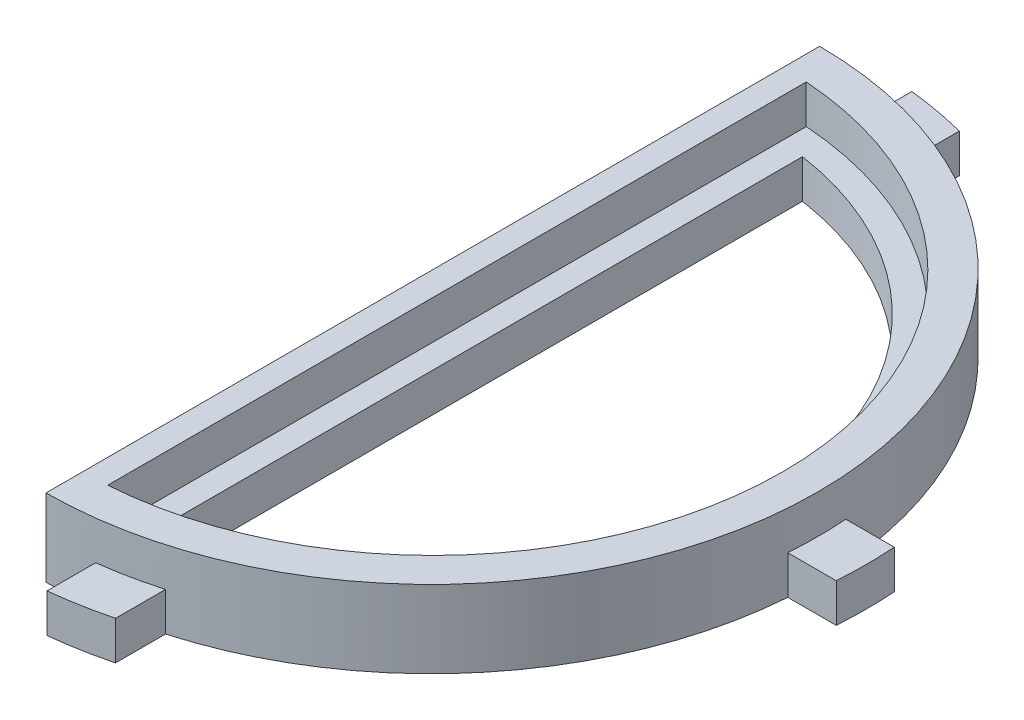
ISO-10303-21;
HEADER;
FILE_DESCRIPTION(('STEP AP214'),'2;1');
FILE_NAME('part.step','',(''),(''),'','','');
FILE_SCHEMA(('AUTOMOTIVE_DESIGN { 1 0 10303 214 1 1 1 1 }'));
ENDSEC;
DATA;
#1=APPLICATION_CONTEXT('core data for automotive mechanical design processes');
#2=APPLICATION_PROTOCOL_DEFINITION('international standard','automotive_design',2000,#1);
#3=PRODUCT_CONTEXT('',#1,'mechanical');
#4=PRODUCT('Part','Part','',(#3));
#5=PRODUCT_RELATED_PRODUCT_CATEGORY('part','',(#4));
#6=PRODUCT_DEFINITION_FORMATION('','',#4);
#7=PRODUCT_DEFINITION_CONTEXT('part definition',#1,'design');
#8=PRODUCT_DEFINITION('design','',#6,#7);
#9=PRODUCT_DEFINITION_SHAPE('','',#8);
#10=(LENGTH_UNIT() NAMED_UNIT(*) SI_UNIT(.MILLI.,.METRE.));
#11=(NAMED_UNIT(*) PLANE_ANGLE_UNIT() SI_UNIT($,.RADIAN.));
#12=(NAMED_UNIT(*) SI_UNIT($,.STERADIAN.) SOLID_ANGLE_UNIT());
#13=UNCERTAINTY_MEASURE_WITH_UNIT(LENGTH_MEASURE(1.E-05),#10,'distance_accuracy_value','');
#14=(GEOMETRIC_REPRESENTATION_CONTEXT(3) GLOBAL_UNCERTAINTY_ASSIGNED_CONTEXT((#13)) GLOBAL_UNIT_ASSIGNED_CONTEXT((#10,
#11,#12)) REPRESENTATION_CONTEXT('',''));
#15=CARTESIAN_POINT('',(0.,0.,0.));
#16=DIRECTION('',(0.,0.,1.));
#17=DIRECTION('',(1.,0.,0.));
#18=AXIS2_PLACEMENT_3D('',#15,#16,#17);
#19=CARTESIAN_POINT('',(0.,21.3,14.9999310053877));
#20=DIRECTION('',(0.,-1.,0.));
#21=DIRECTION('',(0.,0.,-1.));
#22=AXIS2_PLACEMENT_3D('',#19,#20,#21);
#23=PLANE('',#22);
#24=DIRECTION('',(0.,0.,-1.));
#25=VECTOR('',#24,1.);
#26=CARTESIAN_POINT('',(0.,21.3,14.9999310053877));
#27=LINE('',#26,#25);
#28=CARTESIAN_POINT('',(0.,21.3,9.99989650778399));
#29=VERTEX_POINT('',#28);
#30=CARTESIAN_POINT('',(0.,21.3,-9.99989650778399));
#31=VERTEX_POINT('',#30);
#32=EDGE_CURVE('E314',#29,#31,#27,.T.);
#33=ORIENTED_EDGE('',*,*,#32,.F.);
#34=CARTESIAN_POINT('',(-0.0454954240498573,21.3,0.));
#35=DIRECTION('',(0.,-1.,0.));
#36=DIRECTION('',(0.,0.,-1.));
#37=AXIS2_PLACEMENT_3D('',#34,#35,#36);
#38=CIRCLE('',#37,10.);
#39=EDGE_CURVE('E315',#29,#31,#38,.F.);
#40=ORIENTED_EDGE('',*,*,#39,.T.);
#41=EDGE_LOOP('',(#33,#40));
#42=FACE_BOUND('',#41,.T.);
#43=CARTESIAN_POINT('',(0.,21.3,0.));
#44=DIRECTION('',(0.,1.,0.));
#45=DIRECTION('',(0.,0.,1.));
#46=AXIS2_PLACEMENT_3D('',#43,#44,#45);
#47=CIRCLE('',#46,9.05);
#48=CARTESIAN_POINT('',(0.625000000000002,21.3,-9.02839271409922));
#49=VERTEX_POINT('',#48);
#50=CARTESIAN_POINT('',(0.625000000000002,21.3,9.02839271409923));
#51=VERTEX_POINT('',#50);
#52=EDGE_CURVE('E57',#49,#51,#47,.F.);
#53=ORIENTED_EDGE('',*,*,#52,.T.);
#54=DIRECTION('',(0.,0.,1.));
#55=VECTOR('',#54,1.);
#56=CARTESIAN_POINT('',(0.625000000000002,21.3,0.));
#57=LINE('',#56,#55);
#58=EDGE_CURVE('E182',#49,#51,#57,.T.);
#59=ORIENTED_EDGE('',*,*,#58,.F.);
#60=EDGE_LOOP('',(#53,#59));
#61=FACE_BOUND('',#60,.T.);
#62=ADVANCED_FACE('F41',(#42,#61),#23,.F.);
#63=CARTESIAN_POINT('',(0.,19.3,0.));
#64=DIRECTION('',(0.,1.,0.));
#65=DIRECTION('',(0.,0.,1.));
#66=AXIS2_PLACEMENT_3D('',#63,#64,#65);
#67=CYLINDRICAL_SURFACE('',#66,8.4);
#68=CARTESIAN_POINT('',(0.,20.3,0.));
#69=DIRECTION('',(0.,1.,0.));
#70=DIRECTION('',(0.,0.,1.));
#71=AXIS2_PLACEMENT_3D('',#68,#69,#70);
#72=CIRCLE('',#71,8.4);
#73=CARTESIAN_POINT('',(1.25,20.3,-8.30647337923863));
#74=VERTEX_POINT('',#73);
#75=CARTESIAN_POINT('',(1.25,20.3,8.30647337923863));
#76=VERTEX_POINT('',#75);
#77=EDGE_CURVE('E64',#74,#76,#72,.F.);
#78=ORIENTED_EDGE('',*,*,#77,.F.);
#79=DIRECTION('',(0.,1.,0.));
#80=VECTOR('',#79,1.);
#81=CARTESIAN_POINT('',(1.25,19.3,-8.30647337923863));
#82=LINE('',#81,#80);
#83=CARTESIAN_POINT('',(1.25,19.3,-8.30647337923863));
#84=VERTEX_POINT('',#83);
#85=EDGE_CURVE('E206',#84,#74,#82,.T.);
#86=ORIENTED_EDGE('',*,*,#85,.F.);
#87=CARTESIAN_POINT('',(0.,19.3,0.));
#88=DIRECTION('',(0.,1.,0.));
#89=DIRECTION('',(0.,0.,-1.));
#90=AXIS2_PLACEMENT_3D('',#87,#88,#89);
#91=CIRCLE('',#90,8.4);
#92=CARTESIAN_POINT('',(1.25,19.3,8.30647337923863));
#93=VERTEX_POINT('',#92);
#94=EDGE_CURVE('E197',#93,#84,#91,.T.);
#95=ORIENTED_EDGE('',*,*,#94,.F.);
#96=DIRECTION('',(0.,1.,0.));
#97=VECTOR('',#96,1.);
#98=CARTESIAN_POINT('',(1.25,19.3,8.30647337923863));
#99=LINE('',#98,#97);
#100=EDGE_CURVE('E207',#93,#76,#99,.T.);
#101=ORIENTED_EDGE('',*,*,#100,.T.);
#102=EDGE_LOOP('',(#78,#86,#95,#101));
#103=FACE_BOUND('',#102,.T.);
#104=ADVANCED_FACE('F408',(#103),#67,.F.);
#105=CARTESIAN_POINT('',(1.25,19.3,-8.30647337923863));
#106=DIRECTION('',(-1.,0.,0.));
#107=DIRECTION('',(0.,0.,1.));
#108=AXIS2_PLACEMENT_3D('',#105,#106,#107);
#109=PLANE('',#108);
#110=DIRECTION('',(0.,0.,-1.));
#111=VECTOR('',#110,1.);
#112=CARTESIAN_POINT('',(1.25,20.3,0.));
#113=LINE('',#112,#111);
#114=EDGE_CURVE('E175',#76,#74,#113,.T.);
#115=ORIENTED_EDGE('',*,*,#114,.F.);
#116=ORIENTED_EDGE('',*,*,#100,.F.);
#117=DIRECTION('',(0.,0.,1.));
#118=VECTOR('',#117,1.);
#119=CARTESIAN_POINT('',(1.25,19.3,-8.30647337923863));
#120=LINE('',#119,#118);
#121=EDGE_CURVE('E202',#84,#93,#120,.T.);
#122=ORIENTED_EDGE('',*,*,#121,.F.);
#123=ORIENTED_EDGE('',*,*,#85,.T.);
#124=EDGE_LOOP('',(#115,#116,#122,#123));
#125=FACE_BOUND('',#124,.T.);
#126=ADVANCED_FACE('F413',(#125),#109,.F.);
#127=CARTESIAN_POINT('',(-0.0454954240498573,-1.6,0.));
#128=DIRECTION('',(0.,-1.,0.));
#129=DIRECTION('',(0.,0.,-1.));
#130=AXIS2_PLACEMENT_3D('',#127,#128,#129);
#131=CYLINDRICAL_SURFACE('',#130,10.);
#132=DIRECTION('',(0.,-1.,0.));
#133=VECTOR('',#132,1.);
#134=CARTESIAN_POINT('',(9.9263399135397,-1.6,0.749999999999998));
#135=LINE('',#134,#133);
#136=CARTESIAN_POINT('',(9.9263399135397,20.3,0.75));
#137=VERTEX_POINT('',#136);
#138=CARTESIAN_POINT('',(9.9263399135397,19.3,0.750000000000001));
#139=VERTEX_POINT('',#138);
#140=EDGE_CURVE('E254',#137,#139,#135,.T.);
#141=ORIENTED_EDGE('',*,*,#140,.F.);
#142=CARTESIAN_POINT('',(-0.0454954240498573,20.3,0.));
#143=DIRECTION('',(0.,-1.,0.));
#144=DIRECTION('',(0.,0.,-1.));
#145=AXIS2_PLACEMENT_3D('',#142,#143,#144);
#146=CIRCLE('',#145,10.);
#147=CARTESIAN_POINT('',(9.9263399135397,20.3,-0.75));
#148=VERTEX_POINT('',#147);
#149=EDGE_CURVE('E219',#148,#137,#146,.T.);
#150=ORIENTED_EDGE('',*,*,#149,.F.);
#151=DIRECTION('',(0.,-1.,0.));
#152=VECTOR('',#151,1.);
#153=CARTESIAN_POINT('',(9.9263399135397,-1.6,-0.750000000000005));
#154=LINE('',#153,#152);
#155=CARTESIAN_POINT('',(9.9263399135397,19.3,-0.750000000000001));
#156=VERTEX_POINT('',#155);
#157=EDGE_CURVE('E250',#156,#148,#154,.F.);
#158=ORIENTED_EDGE('',*,*,#157,.F.);
#159=CARTESIAN_POINT('',(-0.0454954240498573,19.3,0.));
#160=DIRECTION('',(0.,1.,0.));
#161=DIRECTION('',(0.,0.,1.));
#162=AXIS2_PLACEMENT_3D('',#159,#160,#161);
#163=CIRCLE('',#162,10.);
#164=CARTESIAN_POINT('',(2.70450457595015,19.3,-9.6144422615147));
#165=VERTEX_POINT('',#164);
#166=EDGE_CURVE('E324',#165,#156,#163,.F.);
#167=ORIENTED_EDGE('',*,*,#166,.F.);
#168=DIRECTION('',(0.,-1.,0.));
#169=VECTOR('',#168,1.);
#170=CARTESIAN_POINT('',(2.70450457595015,-1.6,-9.6144422615147));
#171=LINE('',#170,#169);
#172=CARTESIAN_POINT('',(2.70450457595014,20.3,-9.6144422615147));
#173=VERTEX_POINT('',#172);
#174=EDGE_CURVE('E50',#173,#165,#171,.T.);
#175=ORIENTED_EDGE('',*,*,#174,.F.);
#176=CARTESIAN_POINT('',(-0.0454954240498573,20.3,0.));
#177=DIRECTION('',(0.,-1.,0.));
#178=DIRECTION('',(0.,0.,-1.));
#179=AXIS2_PLACEMENT_3D('',#176,#177,#178);
#180=CIRCLE('',#179,10.);
#181=CARTESIAN_POINT('',(1.20450457595015,20.3,-9.92156741649221));
#182=VERTEX_POINT('',#181);
#183=EDGE_CURVE('E340',#182,#173,#180,.T.);
#184=ORIENTED_EDGE('',*,*,#183,.F.);
#185=DIRECTION('',(0.,-1.,0.));
#186=VECTOR('',#185,1.);
#187=CARTESIAN_POINT('',(1.20450457595015,-1.6,-9.92156741649221));
#188=LINE('',#187,#186);
#189=CARTESIAN_POINT('',(1.20450457595015,19.3,-9.92156741649221));
#190=VERTEX_POINT('',#189);
#191=EDGE_CURVE('E11',#190,#182,#188,.F.);
#192=ORIENTED_EDGE('',*,*,#191,.F.);
#193=CARTESIAN_POINT('',(0.,19.3,-9.99989650778399));
#194=VERTEX_POINT('',#193);
#195=EDGE_CURVE('E320',#194,#190,#163,.F.);
#196=ORIENTED_EDGE('',*,*,#195,.F.);
#197=DIRECTION('',(0.,-1.,0.));
#198=VECTOR('',#197,1.);
#199=CARTESIAN_POINT('',(0.,-1.6,-9.99989650778399));
#200=LINE('',#199,#198);
#201=EDGE_CURVE('E279',#194,#31,#200,.F.);
#202=ORIENTED_EDGE('',*,*,#201,.T.);
#203=ORIENTED_EDGE('',*,*,#39,.F.);
#204=DIRECTION('',(0.,-1.,0.));
#205=VECTOR('',#204,1.);
#206=CARTESIAN_POINT('',(0.,-1.6,9.99989650778399));
#207=LINE('',#206,#205);
#208=CARTESIAN_POINT('',(0.,19.3,9.99989650778399));
#209=VERTEX_POINT('',#208);
#210=EDGE_CURVE('E319',#209,#29,#207,.F.);
#211=ORIENTED_EDGE('',*,*,#210,.F.);
#212=CARTESIAN_POINT('',(1.20450457595015,19.3,9.92156741649221));
#213=VERTEX_POINT('',#212);
#214=EDGE_CURVE('E335',#213,#209,#163,.F.);
#215=ORIENTED_EDGE('',*,*,#214,.F.);
#216=DIRECTION('',(0.,-1.,0.));
#217=VECTOR('',#216,1.);
#218=CARTESIAN_POINT('',(1.20450457595015,-1.6,9.92156741649221));
#219=LINE('',#218,#217);
#220=CARTESIAN_POINT('',(1.20450457595015,20.3,9.92156741649221));
#221=VERTEX_POINT('',#220);
#222=EDGE_CURVE('E344',#221,#213,#219,.T.);
#223=ORIENTED_EDGE('',*,*,#222,.F.);
#224=CARTESIAN_POINT('',(2.70450457595014,20.3,9.6144422615147));
#225=VERTEX_POINT('',#224);
#226=EDGE_CURVE('E318',#225,#221,#180,.T.);
#227=ORIENTED_EDGE('',*,*,#226,.F.);
#228=DIRECTION('',(0.,-1.,0.));
#229=VECTOR('',#228,1.);
#230=CARTESIAN_POINT('',(2.70450457595015,-1.6,9.6144422615147));
#231=LINE('',#230,#229);
#232=CARTESIAN_POINT('',(2.70450457595015,19.3,9.6144422615147));
#233=VERTEX_POINT('',#232);
#234=EDGE_CURVE('E339',#233,#225,#231,.F.);
#235=ORIENTED_EDGE('',*,*,#234,.F.);
#236=EDGE_CURVE('E325',#139,#233,#163,.F.);
#237=ORIENTED_EDGE('',*,*,#236,.F.);
#238=EDGE_LOOP('',(#141,#150,#158,#167,#175,#184,#192,#196,#202,#203,#211,#215,#223,#227,#235,#237));
#239=FACE_BOUND('',#238,.T.);
#240=ADVANCED_FACE('F378',(#239),#131,.T.);
#241=CARTESIAN_POINT('',(0.,19.3,14.9999310053877));
#242=DIRECTION('',(0.,1.,0.));
#243=DIRECTION('',(0.,0.,1.));
#244=AXIS2_PLACEMENT_3D('',#241,#242,#243);
#245=PLANE('',#244);
#246=ORIENTED_EDGE('',*,*,#121,.T.);
#247=ORIENTED_EDGE('',*,*,#94,.T.);
#248=EDGE_LOOP('',(#246,#247));
#249=FACE_BOUND('',#248,.T.);
#250=ORIENTED_EDGE('',*,*,#166,.T.);
#251=DIRECTION('',(-1.,0.,0.));
#252=VECTOR('',#251,1.);
#253=CARTESIAN_POINT('',(11.2055045759501,19.3,-0.75));
#254=LINE('',#253,#252);
#255=CARTESIAN_POINT('',(11.1794767362719,19.3,-0.75));
#256=VERTEX_POINT('',#255);
#257=EDGE_CURVE('E237',#256,#156,#254,.T.);
#258=ORIENTED_EDGE('',*,*,#257,.F.);
#259=CARTESIAN_POINT('',(-0.0454954240498573,19.3,0.));
#260=DIRECTION('',(0.,1.,0.));
#261=DIRECTION('',(0.,0.,1.));
#262=AXIS2_PLACEMENT_3D('',#259,#260,#261);
#263=CIRCLE('',#262,11.25);
#264=CARTESIAN_POINT('',(11.179476736272,19.3,0.75));
#265=VERTEX_POINT('',#264);
#266=EDGE_CURVE('E220',#265,#256,#263,.T.);
#267=ORIENTED_EDGE('',*,*,#266,.F.);
#268=DIRECTION('',(-1.,0.,0.));
#269=VECTOR('',#268,1.);
#270=CARTESIAN_POINT('',(11.2055045759501,19.3,0.75));
#271=LINE('',#270,#269);
#272=EDGE_CURVE('E233',#265,#139,#271,.T.);
#273=ORIENTED_EDGE('',*,*,#272,.T.);
#274=ORIENTED_EDGE('',*,*,#236,.T.);
#275=DIRECTION('',(0.,0.,-1.));
#276=VECTOR('',#275,1.);
#277=CARTESIAN_POINT('',(2.70450457595014,19.3,11.251));
#278=LINE('',#277,#276);
#279=CARTESIAN_POINT('',(2.70450457595014,19.3,10.9087121146357));
#280=VERTEX_POINT('',#279);
#281=EDGE_CURVE('E299',#280,#233,#278,.T.);
#282=ORIENTED_EDGE('',*,*,#281,.F.);
#283=CARTESIAN_POINT('',(-0.0454954240498573,19.3,0.));
#284=DIRECTION('',(0.,1.,0.));
#285=DIRECTION('',(0.,0.,1.));
#286=AXIS2_PLACEMENT_3D('',#283,#284,#285);
#287=CIRCLE('',#286,11.25);
#288=CARTESIAN_POINT('',(1.20450457595015,19.3,11.1803398874989));
#289=VERTEX_POINT('',#288);
#290=EDGE_CURVE('E280',#289,#280,#287,.T.);
#291=ORIENTED_EDGE('',*,*,#290,.F.);
#292=DIRECTION('',(0.,0.,-1.));
#293=VECTOR('',#292,1.);
#294=CARTESIAN_POINT('',(1.20450457595015,19.3,11.251));
#295=LINE('',#294,#293);
#296=EDGE_CURVE('E293',#289,#213,#295,.T.);
#297=ORIENTED_EDGE('',*,*,#296,.T.);
#298=ORIENTED_EDGE('',*,*,#214,.T.);
#299=DIRECTION('',(0.,0.,-1.));
#300=VECTOR('',#299,1.);
#301=CARTESIAN_POINT('',(0.,19.3,14.9999310053877));
#302=LINE('',#301,#300);
#303=EDGE_CURVE('E332',#209,#194,#302,.T.);
#304=ORIENTED_EDGE('',*,*,#303,.T.);
#305=ORIENTED_EDGE('',*,*,#195,.T.);
#306=CARTESIAN_POINT('',(1.20450457595015,19.3,-11.1803398874989));
#307=VERTEX_POINT('',#306);
#308=EDGE_CURVE('E298',#190,#307,#295,.T.);
#309=ORIENTED_EDGE('',*,*,#308,.T.);
#310=CARTESIAN_POINT('',(-0.0454954240498573,19.3,0.));
#311=DIRECTION('',(0.,-1.,0.));
#312=DIRECTION('',(0.,0.,-1.));
#313=AXIS2_PLACEMENT_3D('',#310,#311,#312);
#314=CIRCLE('',#313,11.25);
#315=CARTESIAN_POINT('',(2.70450457595014,19.3,-10.9087121146357));
#316=VERTEX_POINT('',#315);
#317=EDGE_CURVE('E258',#307,#316,#314,.T.);
#318=ORIENTED_EDGE('',*,*,#317,.T.);
#319=EDGE_CURVE('E297',#165,#316,#278,.T.);
#320=ORIENTED_EDGE('',*,*,#319,.F.);
#321=EDGE_LOOP('',(#250,#258,#267,#273,#274,#282,#291,#297,#298,#304,#305,#309,#318,#320));
#322=FACE_BOUND('',#321,.T.);
#323=ADVANCED_FACE('F374',(#249,#322),#245,.F.);
#324=CARTESIAN_POINT('',(0.,21.3,14.9999310053877));
#325=DIRECTION('',(1.,0.,0.));
#326=DIRECTION('',(0.,1.,0.));
#327=AXIS2_PLACEMENT_3D('',#324,#325,#326);
#328=PLANE('',#327);
#329=ORIENTED_EDGE('',*,*,#201,.F.);
#330=ORIENTED_EDGE('',*,*,#303,.F.);
#331=ORIENTED_EDGE('',*,*,#210,.T.);
#332=ORIENTED_EDGE('',*,*,#32,.T.);
#333=EDGE_LOOP('',(#329,#330,#331,#332));
#334=FACE_BOUND('',#333,.T.);
#335=ADVANCED_FACE('F43',(#334),#328,.F.);
#336=CARTESIAN_POINT('',(-0.0454954240498573,-1.6,0.));
#337=DIRECTION('',(0.,-1.,0.));
#338=DIRECTION('',(0.,0.,-1.));
#339=AXIS2_PLACEMENT_3D('',#336,#337,#338);
#340=CYLINDRICAL_SURFACE('',#339,11.25);
#341=CARTESIAN_POINT('',(-0.0454954240498573,20.3,0.));
#342=DIRECTION('',(0.,-1.,0.));
#343=DIRECTION('',(0.,0.,-1.));
#344=AXIS2_PLACEMENT_3D('',#341,#342,#343);
#345=CIRCLE('',#344,11.25);
#346=CARTESIAN_POINT('',(2.70450457595014,20.3,10.9087121146357));
#347=VERTEX_POINT('',#346);
#348=CARTESIAN_POINT('',(1.20450457595015,20.3,11.1803398874989));
#349=VERTEX_POINT('',#348);
#350=EDGE_CURVE('E288',#347,#349,#345,.T.);
#351=ORIENTED_EDGE('',*,*,#350,.T.);
#352=DIRECTION('',(0.,-1.,0.));
#353=VECTOR('',#352,1.);
#354=CARTESIAN_POINT('',(1.20450457595015,-1.6,11.1803398874989));
#355=LINE('',#354,#353);
#356=EDGE_CURVE('E284',#349,#289,#355,.T.);
#357=ORIENTED_EDGE('',*,*,#356,.T.);
#358=ORIENTED_EDGE('',*,*,#290,.T.);
#359=DIRECTION('',(0.,-1.,0.));
#360=VECTOR('',#359,1.);
#361=CARTESIAN_POINT('',(2.70450457595015,-1.6,10.9087121146357));
#362=LINE('',#361,#360);
#363=EDGE_CURVE('E275',#280,#347,#362,.F.);
#364=ORIENTED_EDGE('',*,*,#363,.T.);
#365=EDGE_LOOP('',(#351,#357,#358,#364));
#366=FACE_BOUND('',#365,.T.);
#367=ADVANCED_FACE('F391',(#366),#340,.T.);
#368=CARTESIAN_POINT('',(1.20450457595015,20.3,11.251));
#369=DIRECTION('',(0.,-1.,0.));
#370=DIRECTION('',(0.,0.,-1.));
#371=AXIS2_PLACEMENT_3D('',#368,#369,#370);
#372=PLANE('',#371);
#373=DIRECTION('',(0.,0.,-1.));
#374=VECTOR('',#373,1.);
#375=CARTESIAN_POINT('',(2.70450457595014,20.3,11.251));
#376=LINE('',#375,#374);
#377=EDGE_CURVE('E292',#347,#225,#376,.T.);
#378=ORIENTED_EDGE('',*,*,#377,.T.);
#379=ORIENTED_EDGE('',*,*,#226,.T.);
#380=DIRECTION('',(0.,0.,-1.));
#381=VECTOR('',#380,1.);
#382=CARTESIAN_POINT('',(1.20450457595015,20.3,11.251));
#383=LINE('',#382,#381);
#384=EDGE_CURVE('E307',#349,#221,#383,.T.);
#385=ORIENTED_EDGE('',*,*,#384,.F.);
#386=ORIENTED_EDGE('',*,*,#350,.F.);
#387=EDGE_LOOP('',(#378,#379,#385,#386));
#388=FACE_BOUND('',#387,.T.);
#389=ADVANCED_FACE('F394',(#388),#372,.F.);
#390=CARTESIAN_POINT('',(2.70450457595014,20.3,11.251));
#391=DIRECTION('',(-1.,0.,0.));
#392=DIRECTION('',(0.,-1.,0.));
#393=AXIS2_PLACEMENT_3D('',#390,#391,#392);
#394=PLANE('',#393);
#395=ORIENTED_EDGE('',*,*,#281,.T.);
#396=ORIENTED_EDGE('',*,*,#234,.T.);
#397=ORIENTED_EDGE('',*,*,#377,.F.);
#398=ORIENTED_EDGE('',*,*,#363,.F.);
#399=EDGE_LOOP('',(#395,#396,#397,#398));
#400=FACE_BOUND('',#399,.T.);
#401=ADVANCED_FACE('F397',(#400),#394,.F.);
#402=CARTESIAN_POINT('',(1.20450457595015,20.3,11.251));
#403=DIRECTION('',(1.,0.,0.));
#404=DIRECTION('',(0.,0.,-1.));
#405=AXIS2_PLACEMENT_3D('',#402,#403,#404);
#406=PLANE('',#405);
#407=ORIENTED_EDGE('',*,*,#384,.T.);
#408=ORIENTED_EDGE('',*,*,#222,.T.);
#409=ORIENTED_EDGE('',*,*,#296,.F.);
#410=ORIENTED_EDGE('',*,*,#356,.F.);
#411=EDGE_LOOP('',(#407,#408,#409,#410));
#412=FACE_BOUND('',#411,.T.);
#413=ADVANCED_FACE('F387',(#412),#406,.F.);
#414=ORIENTED_EDGE('',*,*,#308,.F.);
#415=ORIENTED_EDGE('',*,*,#191,.T.);
#416=CARTESIAN_POINT('',(1.20450457595015,20.3,-11.1803398874989));
#417=VERTEX_POINT('',#416);
#418=EDGE_CURVE('E267',#182,#417,#383,.T.);
#419=ORIENTED_EDGE('',*,*,#418,.T.);
#420=DIRECTION('',(0.,-1.,0.));
#421=VECTOR('',#420,1.);
#422=CARTESIAN_POINT('',(1.20450457595015,-1.6,-11.1803398874989));
#423=LINE('',#422,#421);
#424=EDGE_CURVE('E263',#417,#307,#423,.T.);
#425=ORIENTED_EDGE('',*,*,#424,.T.);
#426=EDGE_LOOP('',(#414,#415,#419,#425));
#427=FACE_BOUND('',#426,.T.);
#428=ADVANCED_FACE('F368',(#427),#406,.F.);
#429=CARTESIAN_POINT('',(2.70450457595015,20.3,-10.9087121146357));
#430=VERTEX_POINT('',#429);
#431=EDGE_CURVE('E303',#173,#430,#376,.T.);
#432=ORIENTED_EDGE('',*,*,#431,.F.);
#433=ORIENTED_EDGE('',*,*,#174,.T.);
#434=ORIENTED_EDGE('',*,*,#319,.T.);
#435=DIRECTION('',(0.,-1.,0.));
#436=VECTOR('',#435,1.);
#437=CARTESIAN_POINT('',(2.70450457595015,-1.6,-10.9087121146357));
#438=LINE('',#437,#436);
#439=EDGE_CURVE('E262',#316,#430,#438,.F.);
#440=ORIENTED_EDGE('',*,*,#439,.T.);
#441=EDGE_LOOP('',(#432,#433,#434,#440));
#442=FACE_BOUND('',#441,.T.);
#443=ADVANCED_FACE('F359',(#442),#394,.F.);
#444=ORIENTED_EDGE('',*,*,#418,.F.);
#445=ORIENTED_EDGE('',*,*,#183,.T.);
#446=ORIENTED_EDGE('',*,*,#431,.T.);
#447=CARTESIAN_POINT('',(-0.0454954240498573,20.3,0.));
#448=DIRECTION('',(0.,1.,0.));
#449=DIRECTION('',(0.,0.,1.));
#450=AXIS2_PLACEMENT_3D('',#447,#448,#449);
#451=CIRCLE('',#450,11.25);
#452=EDGE_CURVE('E268',#430,#417,#451,.T.);
#453=ORIENTED_EDGE('',*,*,#452,.T.);
#454=EDGE_LOOP('',(#444,#445,#446,#453));
#455=FACE_BOUND('',#454,.T.);
#456=ADVANCED_FACE('F356',(#455),#372,.F.);
#457=CARTESIAN_POINT('',(-0.0454954240498573,-1.6,0.));
#458=DIRECTION('',(0.,-1.,0.));
#459=DIRECTION('',(0.,0.,-1.));
#460=AXIS2_PLACEMENT_3D('',#457,#458,#459);
#461=CYLINDRICAL_SURFACE('',#460,11.25);
#462=ORIENTED_EDGE('',*,*,#424,.F.);
#463=ORIENTED_EDGE('',*,*,#452,.F.);
#464=ORIENTED_EDGE('',*,*,#439,.F.);
#465=ORIENTED_EDGE('',*,*,#317,.F.);
#466=EDGE_LOOP('',(#462,#463,#464,#465));
#467=FACE_BOUND('',#466,.T.);
#468=ADVANCED_FACE('F371',(#467),#461,.T.);
#469=CARTESIAN_POINT('',(11.2055045759501,20.3,0.75));
#470=DIRECTION('',(0.,0.,-1.));
#471=DIRECTION('',(0.,1.,0.));
#472=AXIS2_PLACEMENT_3D('',#469,#470,#471);
#473=PLANE('',#472);
#474=DIRECTION('',(-1.,0.,0.));
#475=VECTOR('',#474,1.);
#476=CARTESIAN_POINT('',(11.2055045759501,20.3,0.75));
#477=LINE('',#476,#475);
#478=CARTESIAN_POINT('',(11.179476736272,20.3,0.75));
#479=VERTEX_POINT('',#478);
#480=EDGE_CURVE('E211',#479,#137,#477,.T.);
#481=ORIENTED_EDGE('',*,*,#480,.T.);
#482=ORIENTED_EDGE('',*,*,#140,.T.);
#483=ORIENTED_EDGE('',*,*,#272,.F.);
#484=DIRECTION('',(0.,-1.,0.));
#485=VECTOR('',#484,1.);
#486=CARTESIAN_POINT('',(11.179476736272,-1.6,0.749999999999998));
#487=LINE('',#486,#485);
#488=EDGE_CURVE('E224',#479,#265,#487,.T.);
#489=ORIENTED_EDGE('',*,*,#488,.F.);
#490=EDGE_LOOP('',(#481,#482,#483,#489));
#491=FACE_BOUND('',#490,.T.);
#492=ADVANCED_FACE('F446',(#491),#473,.F.);
#493=CARTESIAN_POINT('',(11.2055045759501,20.3,-0.75));
#494=DIRECTION('',(0.,0.,1.));
#495=DIRECTION('',(0.,-1.,0.));
#496=AXIS2_PLACEMENT_3D('',#493,#494,#495);
#497=PLANE('',#496);
#498=ORIENTED_EDGE('',*,*,#257,.T.);
#499=ORIENTED_EDGE('',*,*,#157,.T.);
#500=DIRECTION('',(-1.,0.,0.));
#501=VECTOR('',#500,1.);
#502=CARTESIAN_POINT('',(11.2055045759501,20.3,-0.75));
#503=LINE('',#502,#501);
#504=CARTESIAN_POINT('',(11.179476736272,20.3,-0.75));
#505=VERTEX_POINT('',#504);
#506=EDGE_CURVE('E232',#505,#148,#503,.T.);
#507=ORIENTED_EDGE('',*,*,#506,.F.);
#508=DIRECTION('',(0.,-1.,0.));
#509=VECTOR('',#508,1.);
#510=CARTESIAN_POINT('',(11.1794767362719,-1.6,-0.750000000000005));
#511=LINE('',#510,#509);
#512=EDGE_CURVE('E215',#256,#505,#511,.F.);
#513=ORIENTED_EDGE('',*,*,#512,.F.);
#514=EDGE_LOOP('',(#498,#499,#507,#513));
#515=FACE_BOUND('',#514,.T.);
#516=ADVANCED_FACE('F442',(#515),#497,.F.);
#517=CARTESIAN_POINT('',(11.2055045759501,20.3,0.75));
#518=DIRECTION('',(0.,-1.,0.));
#519=DIRECTION('',(0.,0.,-1.));
#520=AXIS2_PLACEMENT_3D('',#517,#518,#519);
#521=PLANE('',#520);
#522=ORIENTED_EDGE('',*,*,#506,.T.);
#523=ORIENTED_EDGE('',*,*,#149,.T.);
#524=ORIENTED_EDGE('',*,*,#480,.F.);
#525=CARTESIAN_POINT('',(-0.0454954240498573,20.3,0.));
#526=DIRECTION('',(0.,-1.,0.));
#527=DIRECTION('',(0.,0.,-1.));
#528=AXIS2_PLACEMENT_3D('',#525,#526,#527);
#529=CIRCLE('',#528,11.25);
#530=EDGE_CURVE('E228',#505,#479,#529,.T.);
#531=ORIENTED_EDGE('',*,*,#530,.F.);
#532=EDGE_LOOP('',(#522,#523,#524,#531));
#533=FACE_BOUND('',#532,.T.);
#534=ADVANCED_FACE('F439',(#533),#521,.F.);
#535=CARTESIAN_POINT('',(-0.0454954240498573,-1.6,0.));
#536=DIRECTION('',(0.,-1.,0.));
#537=DIRECTION('',(0.,0.,-1.));
#538=AXIS2_PLACEMENT_3D('',#535,#536,#537);
#539=CYLINDRICAL_SURFACE('',#538,11.25);
#540=ORIENTED_EDGE('',*,*,#530,.T.);
#541=ORIENTED_EDGE('',*,*,#488,.T.);
#542=ORIENTED_EDGE('',*,*,#266,.T.);
#543=ORIENTED_EDGE('',*,*,#512,.T.);
#544=EDGE_LOOP('',(#540,#541,#542,#543));
#545=FACE_BOUND('',#544,.T.);
#546=ADVANCED_FACE('F436',(#545),#539,.T.);
#547=CARTESIAN_POINT('',(0.,20.3,0.));
#548=DIRECTION('',(0.,1.,0.));
#549=DIRECTION('',(0.,0.,1.));
#550=AXIS2_PLACEMENT_3D('',#547,#548,#549);
#551=CYLINDRICAL_SURFACE('',#550,9.05);
#552=ORIENTED_EDGE('',*,*,#52,.F.);
#553=DIRECTION('',(0.,1.,0.));
#554=VECTOR('',#553,1.);
#555=CARTESIAN_POINT('',(0.625000000000002,20.3,-9.02839271409923));
#556=LINE('',#555,#554);
#557=CARTESIAN_POINT('',(0.625000000000002,20.3,-9.02839271409923));
#558=VERTEX_POINT('',#557);
#559=EDGE_CURVE('E164',#558,#49,#556,.T.);
#560=ORIENTED_EDGE('',*,*,#559,.F.);
#561=CARTESIAN_POINT('',(0.,20.3,0.));
#562=DIRECTION('',(0.,1.,0.));
#563=DIRECTION('',(0.,0.,1.));
#564=AXIS2_PLACEMENT_3D('',#561,#562,#563);
#565=CIRCLE('',#564,9.05);
#566=CARTESIAN_POINT('',(0.625000000000002,20.3,9.02839271409923));
#567=VERTEX_POINT('',#566);
#568=EDGE_CURVE('E167',#558,#567,#565,.F.);
#569=ORIENTED_EDGE('',*,*,#568,.T.);
#570=DIRECTION('',(0.,1.,0.));
#571=VECTOR('',#570,1.);
#572=CARTESIAN_POINT('',(0.625000000000002,20.3,9.02839271409923));
#573=LINE('',#572,#571);
#574=EDGE_CURVE('E174',#567,#51,#573,.T.);
#575=ORIENTED_EDGE('',*,*,#574,.T.);
#576=EDGE_LOOP('',(#552,#560,#569,#575));
#577=FACE_BOUND('',#576,.T.);
#578=ADVANCED_FACE('F166',(#577),#551,.F.);
#579=CARTESIAN_POINT('',(0.625000000000002,20.3,0.));
#580=DIRECTION('',(-1.,0.,0.));
#581=DIRECTION('',(0.,0.,1.));
#582=AXIS2_PLACEMENT_3D('',#579,#580,#581);
#583=PLANE('',#582);
#584=ORIENTED_EDGE('',*,*,#58,.T.);
#585=ORIENTED_EDGE('',*,*,#574,.F.);
#586=DIRECTION('',(0.,0.,1.));
#587=VECTOR('',#586,1.);
#588=CARTESIAN_POINT('',(0.625000000000002,20.3,0.));
#589=LINE('',#588,#587);
#590=EDGE_CURVE('E180',#558,#567,#589,.T.);
#591=ORIENTED_EDGE('',*,*,#590,.F.);
#592=ORIENTED_EDGE('',*,*,#559,.T.);
#593=EDGE_LOOP('',(#584,#585,#591,#592));
#594=FACE_BOUND('',#593,.T.);
#595=ADVANCED_FACE('F184',(#594),#583,.F.);
#596=CARTESIAN_POINT('',(0.,20.3,0.));
#597=DIRECTION('',(0.,1.,0.));
#598=DIRECTION('',(0.,0.,1.));
#599=AXIS2_PLACEMENT_3D('',#596,#597,#598);
#600=PLANE('',#599);
#601=ORIENTED_EDGE('',*,*,#568,.F.);
#602=ORIENTED_EDGE('',*,*,#590,.T.);
#603=EDGE_LOOP('',(#601,#602));
#604=FACE_BOUND('',#603,.T.);
#605=ORIENTED_EDGE('',*,*,#77,.T.);
#606=ORIENTED_EDGE('',*,*,#114,.T.);
#607=EDGE_LOOP('',(#605,#606));
#608=FACE_BOUND('',#607,.T.);
#609=ADVANCED_FACE('F179',(#604,#608),#600,.T.);
#610=CLOSED_SHELL('',(#62,#104,#126,#240,#323,#335,#367,#389,#401,#413,#428,#443,#456,#468,#492,
#516,#534,#546,#578,#595,#609));
#611=MANIFOLD_SOLID_BREP('B2',#610);
#612=ADVANCED_BREP_SHAPE_REPRESENTATION('',(#18,#611),#14);
#613=SHAPE_DEFINITION_REPRESENTATION(#9,#612);
ENDSEC;
END-ISO-10303-21;
